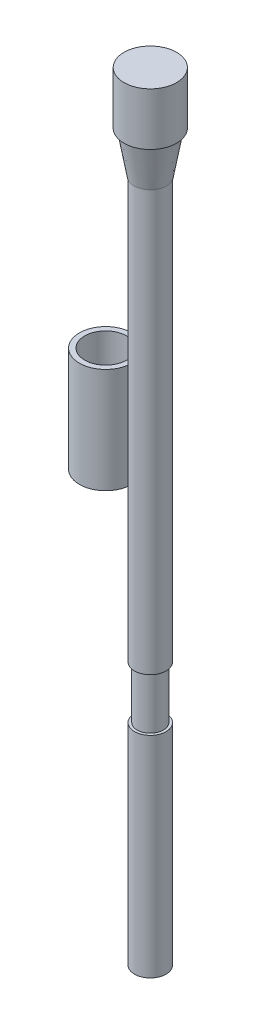
ISO-10303-21;
HEADER;
FILE_DESCRIPTION(('STEP AP214'),'2;1');
FILE_NAME('part.step','',(''),(''),'','','');
FILE_SCHEMA(('AUTOMOTIVE_DESIGN { 1 0 10303 214 1 1 1 1 }'));
ENDSEC;
DATA;
#1=APPLICATION_CONTEXT('core data for automotive mechanical design processes');
#2=APPLICATION_PROTOCOL_DEFINITION('international standard','automotive_design',2000,#1);
#3=PRODUCT_CONTEXT('',#1,'mechanical');
#4=PRODUCT('Part','Part','',(#3));
#5=PRODUCT_RELATED_PRODUCT_CATEGORY('part','',(#4));
#6=PRODUCT_DEFINITION_FORMATION('','',#4);
#7=PRODUCT_DEFINITION_CONTEXT('part definition',#1,'design');
#8=PRODUCT_DEFINITION('design','',#6,#7);
#9=PRODUCT_DEFINITION_SHAPE('','',#8);
#10=(LENGTH_UNIT() NAMED_UNIT(*) SI_UNIT(.MILLI.,.METRE.));
#11=(NAMED_UNIT(*) PLANE_ANGLE_UNIT() SI_UNIT($,.RADIAN.));
#12=(NAMED_UNIT(*) SI_UNIT($,.STERADIAN.) SOLID_ANGLE_UNIT());
#13=UNCERTAINTY_MEASURE_WITH_UNIT(LENGTH_MEASURE(1.E-05),#10,'distance_accuracy_value','');
#14=(GEOMETRIC_REPRESENTATION_CONTEXT(3) GLOBAL_UNCERTAINTY_ASSIGNED_CONTEXT((#13)) GLOBAL_UNIT_ASSIGNED_CONTEXT((#10,
#11,#12)) REPRESENTATION_CONTEXT('',''));
#15=CARTESIAN_POINT('',(0.,0.,0.));
#16=DIRECTION('',(0.,0.,1.));
#17=DIRECTION('',(1.,0.,0.));
#18=AXIS2_PLACEMENT_3D('',#15,#16,#17);
#19=CARTESIAN_POINT('',(-39.9636242911701,-200.,2.52314533475939));
#20=DIRECTION('',(0.,-1.,0.));
#21=DIRECTION('',(0.,0.,-1.));
#22=AXIS2_PLACEMENT_3D('',#19,#20,#21);
#23=CYLINDRICAL_SURFACE('',#22,25.);
#24=CARTESIAN_POINT('',(-39.9636242911701,-200.,2.52314533475939));
#25=DIRECTION('',(0.,1.,0.));
#26=DIRECTION('',(0.,0.,1.));
#27=AXIS2_PLACEMENT_3D('',#24,#25,#26);
#28=CIRCLE('',#27,25.);
#29=CARTESIAN_POINT('',(-39.9636242911701,-200.,27.5231453347594));
#30=VERTEX_POINT('',#29);
#31=EDGE_CURVE('E11',#30,#30,#28,.T.);
#32=ORIENTED_EDGE('',*,*,#31,.F.);
#33=EDGE_LOOP('',(#32));
#34=FACE_BOUND('',#33,.T.);
#35=CARTESIAN_POINT('',(-39.9636242911701,-300.,2.52314533475939));
#36=DIRECTION('',(0.,1.,0.));
#37=DIRECTION('',(0.,0.,1.));
#38=AXIS2_PLACEMENT_3D('',#35,#36,#37);
#39=CIRCLE('',#38,25.);
#40=CARTESIAN_POINT('',(-39.9636242911701,-300.,27.5231453347594));
#41=VERTEX_POINT('',#40);
#42=EDGE_CURVE('E51',#41,#41,#39,.T.);
#43=ORIENTED_EDGE('',*,*,#42,.T.);
#44=EDGE_LOOP('',(#43));
#45=FACE_BOUND('',#44,.T.);
#46=ADVANCED_FACE('F48',(#34,#45),#23,.T.);
#47=CARTESIAN_POINT('',(-39.9636242911701,-200.,2.52314533475939));
#48=DIRECTION('',(0.,1.,0.));
#49=DIRECTION('',(0.,0.,1.));
#50=AXIS2_PLACEMENT_3D('',#47,#48,#49);
#51=PLANE('',#50);
#52=CARTESIAN_POINT('',(-39.9636242911701,-200.,2.52314533475939));
#53=DIRECTION('',(0.,1.,0.));
#54=DIRECTION('',(0.,0.,1.));
#55=AXIS2_PLACEMENT_3D('',#52,#53,#54);
#56=CIRCLE('',#55,20.);
#57=CARTESIAN_POINT('',(-39.9636242911701,-200.,22.5231453347594));
#58=VERTEX_POINT('',#57);
#59=EDGE_CURVE('E60',#58,#58,#56,.T.);
#60=ORIENTED_EDGE('',*,*,#59,.F.);
#61=EDGE_LOOP('',(#60));
#62=FACE_BOUND('',#61,.T.);
#63=ORIENTED_EDGE('',*,*,#31,.T.);
#64=EDGE_LOOP('',(#63));
#65=FACE_BOUND('',#64,.T.);
#66=ADVANCED_FACE('F75',(#62,#65),#51,.T.);
#67=CARTESIAN_POINT('',(-39.9636242911701,-300.,2.52314533475939));
#68=DIRECTION('',(0.,1.,0.));
#69=DIRECTION('',(0.,0.,1.));
#70=AXIS2_PLACEMENT_3D('',#67,#68,#69);
#71=PLANE('',#70);
#72=CARTESIAN_POINT('',(-39.9636242911701,-300.,2.52314533475939));
#73=DIRECTION('',(0.,1.,0.));
#74=DIRECTION('',(0.,0.,1.));
#75=AXIS2_PLACEMENT_3D('',#72,#73,#74);
#76=CIRCLE('',#75,20.);
#77=CARTESIAN_POINT('',(-39.9636242911701,-300.,22.5231453347594));
#78=VERTEX_POINT('',#77);
#79=EDGE_CURVE('E58',#78,#78,#76,.T.);
#80=ORIENTED_EDGE('',*,*,#79,.T.);
#81=EDGE_LOOP('',(#80));
#82=FACE_BOUND('',#81,.T.);
#83=ORIENTED_EDGE('',*,*,#42,.F.);
#84=EDGE_LOOP('',(#83));
#85=FACE_BOUND('',#84,.T.);
#86=ADVANCED_FACE('F66',(#82,#85),#71,.F.);
#87=CARTESIAN_POINT('',(-39.9636242911701,-300.,2.52314533475939));
#88=DIRECTION('',(0.,1.,0.));
#89=DIRECTION('',(0.,0.,1.));
#90=AXIS2_PLACEMENT_3D('',#87,#88,#89);
#91=CYLINDRICAL_SURFACE('',#90,20.);
#92=ORIENTED_EDGE('',*,*,#79,.F.);
#93=EDGE_LOOP('',(#92));
#94=FACE_BOUND('',#93,.T.);
#95=ORIENTED_EDGE('',*,*,#59,.T.);
#96=EDGE_LOOP('',(#95));
#97=FACE_BOUND('',#96,.T.);
#98=ADVANCED_FACE('F69',(#94,#97),#91,.F.);
#99=CLOSED_SHELL('',(#46,#66,#86,#98));
#100=MANIFOLD_SOLID_BREP('B2',#99);
#101=CARTESIAN_POINT('',(0.,50.,0.));
#102=DIRECTION('',(0.,-1.,0.));
#103=DIRECTION('',(0.,0.,-1.));
#104=AXIS2_PLACEMENT_3D('',#101,#102,#103);
#105=CYLINDRICAL_SURFACE('',#104,25.);
#106=CARTESIAN_POINT('',(0.,50.,0.));
#107=DIRECTION('',(0.,1.,0.));
#108=DIRECTION('',(0.,0.,1.));
#109=AXIS2_PLACEMENT_3D('',#106,#107,#108);
#110=CIRCLE('',#109,25.);
#111=CARTESIAN_POINT('',(0.,50.,25.));
#112=VERTEX_POINT('',#111);
#113=EDGE_CURVE('E141',#112,#112,#110,.T.);
#114=ORIENTED_EDGE('',*,*,#113,.F.);
#115=EDGE_LOOP('',(#114));
#116=FACE_BOUND('',#115,.T.);
#117=CARTESIAN_POINT('',(0.,0.,0.));
#118=DIRECTION('',(0.,1.,0.));
#119=DIRECTION('',(0.,0.,1.));
#120=AXIS2_PLACEMENT_3D('',#117,#118,#119);
#121=CIRCLE('',#120,25.);
#122=CARTESIAN_POINT('',(0.,0.,25.));
#123=VERTEX_POINT('',#122);
#124=EDGE_CURVE('E120',#123,#123,#121,.T.);
#125=ORIENTED_EDGE('',*,*,#124,.T.);
#126=EDGE_LOOP('',(#125));
#127=FACE_BOUND('',#126,.T.);
#128=ADVANCED_FACE('F117',(#116,#127),#105,.T.);
#129=CARTESIAN_POINT('',(0.,50.,0.));
#130=DIRECTION('',(0.,1.,0.));
#131=DIRECTION('',(0.,0.,1.));
#132=AXIS2_PLACEMENT_3D('',#129,#130,#131);
#133=PLANE('',#132);
#134=ORIENTED_EDGE('',*,*,#113,.T.);
#135=EDGE_LOOP('',(#134));
#136=FACE_BOUND('',#135,.T.);
#137=ADVANCED_FACE('F153',(#136),#133,.T.);
#138=CARTESIAN_POINT('',(0.,0.,0.));
#139=DIRECTION('',(0.,1.,0.));
#140=DIRECTION('',(0.,0.,1.));
#141=AXIS2_PLACEMENT_3D('',#138,#139,#140);
#142=PLANE('',#141);
#143=CARTESIAN_POINT('',(0.,0.,0.));
#144=DIRECTION('',(0.,-1.,0.));
#145=DIRECTION('',(0.,0.,-1.));
#146=AXIS2_PLACEMENT_3D('',#143,#144,#145);
#147=CIRCLE('',#146,22.5);
#148=CARTESIAN_POINT('',(0.,0.,-22.5));
#149=VERTEX_POINT('',#148);
#150=EDGE_CURVE('E129',#149,#149,#147,.T.);
#151=ORIENTED_EDGE('',*,*,#150,.F.);
#152=EDGE_LOOP('',(#151));
#153=FACE_BOUND('',#152,.T.);
#154=ORIENTED_EDGE('',*,*,#124,.F.);
#155=EDGE_LOOP('',(#154));
#156=FACE_BOUND('',#155,.T.);
#157=ADVANCED_FACE('F150',(#153,#156),#142,.F.);
#158=CARTESIAN_POINT('',(0.,0.,0.));
#159=DIRECTION('',(0.,1.,0.));
#160=DIRECTION('',(0.,0.,-1.));
#161=AXIS2_PLACEMENT_3D('',#158,#159,#160);
#162=CONICAL_SURFACE('',#161,22.5,0.174532925199433);
#163=CARTESIAN_POINT('',(0.,-40.,0.));
#164=DIRECTION('',(0.,-1.,0.));
#165=DIRECTION('',(0.,0.,-1.));
#166=AXIS2_PLACEMENT_3D('',#163,#164,#165);
#167=CIRCLE('',#166,15.4469207716614);
#168=CARTESIAN_POINT('',(0.,-40.,-15.4469207716614));
#169=VERTEX_POINT('',#168);
#170=EDGE_CURVE('E137',#169,#169,#167,.T.);
#171=ORIENTED_EDGE('',*,*,#170,.F.);
#172=EDGE_LOOP('',(#171));
#173=FACE_BOUND('',#172,.T.);
#174=ORIENTED_EDGE('',*,*,#150,.T.);
#175=EDGE_LOOP('',(#174));
#176=FACE_BOUND('',#175,.T.);
#177=ADVANCED_FACE('F152',(#173,#176),#162,.T.);
#178=CARTESIAN_POINT('',(0.,-40.,0.));
#179=DIRECTION('',(0.,-1.,0.));
#180=DIRECTION('',(0.,0.,-1.));
#181=AXIS2_PLACEMENT_3D('',#178,#179,#180);
#182=PLANE('',#181);
#183=CARTESIAN_POINT('',(0.,-40.,0.));
#184=DIRECTION('',(0.,-1.,0.));
#185=DIRECTION('',(0.,0.,-1.));
#186=AXIS2_PLACEMENT_3D('',#183,#184,#185);
#187=CIRCLE('',#186,15.);
#188=CARTESIAN_POINT('',(0.,-40.,-15.));
#189=VERTEX_POINT('',#188);
#190=EDGE_CURVE('E124',#189,#189,#187,.T.);
#191=ORIENTED_EDGE('',*,*,#190,.F.);
#192=EDGE_LOOP('',(#191));
#193=FACE_BOUND('',#192,.T.);
#194=ORIENTED_EDGE('',*,*,#170,.T.);
#195=EDGE_LOOP('',(#194));
#196=FACE_BOUND('',#195,.T.);
#197=ADVANCED_FACE('F159',(#193,#196),#182,.T.);
#198=CARTESIAN_POINT('',(0.,-440.,0.));
#199=DIRECTION('',(0.,1.,0.));
#200=DIRECTION('',(0.,0.,1.));
#201=AXIS2_PLACEMENT_3D('',#198,#199,#200);
#202=CYLINDRICAL_SURFACE('',#201,15.);
#203=CARTESIAN_POINT('',(0.,-440.,0.));
#204=DIRECTION('',(0.,-1.,0.));
#205=DIRECTION('',(0.,0.,-1.));
#206=AXIS2_PLACEMENT_3D('',#203,#204,#205);
#207=CIRCLE('',#206,15.);
#208=CARTESIAN_POINT('',(0.,-440.,-15.));
#209=VERTEX_POINT('',#208);
#210=EDGE_CURVE('E135',#209,#209,#207,.T.);
#211=ORIENTED_EDGE('',*,*,#210,.F.);
#212=EDGE_LOOP('',(#211));
#213=FACE_BOUND('',#212,.T.);
#214=ORIENTED_EDGE('',*,*,#190,.T.);
#215=EDGE_LOOP('',(#214));
#216=FACE_BOUND('',#215,.T.);
#217=ADVANCED_FACE('F200',(#213,#216),#202,.T.);
#218=CARTESIAN_POINT('',(0.,-440.,0.));
#219=DIRECTION('',(0.,-1.,0.));
#220=DIRECTION('',(0.,0.,-1.));
#221=AXIS2_PLACEMENT_3D('',#218,#219,#220);
#222=PLANE('',#221);
#223=CARTESIAN_POINT('',(0.,-440.,0.));
#224=DIRECTION('',(0.,-1.,0.));
#225=DIRECTION('',(0.,0.,-1.));
#226=AXIS2_PLACEMENT_3D('',#223,#224,#225);
#227=CIRCLE('',#226,12.5);
#228=CARTESIAN_POINT('',(0.,-440.,-12.5));
#229=VERTEX_POINT('',#228);
#230=EDGE_CURVE('E47',#229,#229,#227,.T.);
#231=ORIENTED_EDGE('',*,*,#230,.F.);
#232=EDGE_LOOP('',(#231));
#233=FACE_BOUND('',#232,.T.);
#234=ORIENTED_EDGE('',*,*,#210,.T.);
#235=EDGE_LOOP('',(#234));
#236=FACE_BOUND('',#235,.T.);
#237=ADVANCED_FACE('F211',(#233,#236),#222,.T.);
#238=CARTESIAN_POINT('',(0.,-490.,0.));
#239=DIRECTION('',(0.,1.,0.));
#240=DIRECTION('',(0.,0.,1.));
#241=AXIS2_PLACEMENT_3D('',#238,#239,#240);
#242=CYLINDRICAL_SURFACE('',#241,12.5);
#243=CARTESIAN_POINT('',(0.,-490.,0.));
#244=DIRECTION('',(0.,-1.,0.));
#245=DIRECTION('',(0.,0.,-1.));
#246=AXIS2_PLACEMENT_3D('',#243,#244,#245);
#247=CIRCLE('',#246,12.5);
#248=CARTESIAN_POINT('',(0.,-490.,-12.5));
#249=VERTEX_POINT('',#248);
#250=EDGE_CURVE('E133',#249,#249,#247,.T.);
#251=ORIENTED_EDGE('',*,*,#250,.F.);
#252=EDGE_LOOP('',(#251));
#253=FACE_BOUND('',#252,.T.);
#254=ORIENTED_EDGE('',*,*,#230,.T.);
#255=EDGE_LOOP('',(#254));
#256=FACE_BOUND('',#255,.T.);
#257=ADVANCED_FACE('F222',(#253,#256),#242,.T.);
#258=CARTESIAN_POINT('',(0.,-690.,0.));
#259=DIRECTION('',(0.,1.,0.));
#260=DIRECTION('',(0.,0.,1.));
#261=AXIS2_PLACEMENT_3D('',#258,#259,#260);
#262=CYLINDRICAL_SURFACE('',#261,15.);
#263=CARTESIAN_POINT('',(0.,-690.,0.));
#264=DIRECTION('',(0.,-1.,0.));
#265=DIRECTION('',(0.,0.,-1.));
#266=AXIS2_PLACEMENT_3D('',#263,#264,#265);
#267=CIRCLE('',#266,15.);
#268=CARTESIAN_POINT('',(0.,-690.,-15.));
#269=VERTEX_POINT('',#268);
#270=EDGE_CURVE('E284',#269,#269,#267,.T.);
#271=ORIENTED_EDGE('',*,*,#270,.F.);
#272=EDGE_LOOP('',(#271));
#273=FACE_BOUND('',#272,.T.);
#274=CARTESIAN_POINT('',(0.,-490.,0.));
#275=DIRECTION('',(0.,-1.,0.));
#276=DIRECTION('',(0.,0.,-1.));
#277=AXIS2_PLACEMENT_3D('',#274,#275,#276);
#278=CIRCLE('',#277,15.);
#279=CARTESIAN_POINT('',(0.,-490.,-15.));
#280=VERTEX_POINT('',#279);
#281=EDGE_CURVE('E282',#280,#280,#278,.T.);
#282=ORIENTED_EDGE('',*,*,#281,.T.);
#283=EDGE_LOOP('',(#282));
#284=FACE_BOUND('',#283,.T.);
#285=ADVANCED_FACE('F234',(#273,#284),#262,.T.);
#286=CARTESIAN_POINT('',(0.,-690.,0.));
#287=DIRECTION('',(0.,-1.,0.));
#288=DIRECTION('',(0.,0.,-1.));
#289=AXIS2_PLACEMENT_3D('',#286,#287,#288);
#290=PLANE('',#289);
#291=ORIENTED_EDGE('',*,*,#270,.T.);
#292=EDGE_LOOP('',(#291));
#293=FACE_BOUND('',#292,.T.);
#294=ADVANCED_FACE('F245',(#293),#290,.T.);
#295=CARTESIAN_POINT('',(0.,-490.,0.));
#296=DIRECTION('',(0.,-1.,0.));
#297=DIRECTION('',(0.,0.,-1.));
#298=AXIS2_PLACEMENT_3D('',#295,#296,#297);
#299=PLANE('',#298);
#300=ORIENTED_EDGE('',*,*,#250,.T.);
#301=EDGE_LOOP('',(#300));
#302=FACE_BOUND('',#301,.T.);
#303=ORIENTED_EDGE('',*,*,#281,.F.);
#304=EDGE_LOOP('',(#303));
#305=FACE_BOUND('',#304,.T.);
#306=ADVANCED_FACE('F255',(#302,#305),#299,.F.);
#307=CLOSED_SHELL('',(#128,#137,#157,#177,#197,#217,#237,#257,#285,#294,#306));
#308=MANIFOLD_SOLID_BREP('B6',#307);
#309=ADVANCED_BREP_SHAPE_REPRESENTATION('',(#18,#100,#308),#14);
#310=SHAPE_DEFINITION_REPRESENTATION(#9,#309);
ENDSEC;
END-ISO-10303-21;
